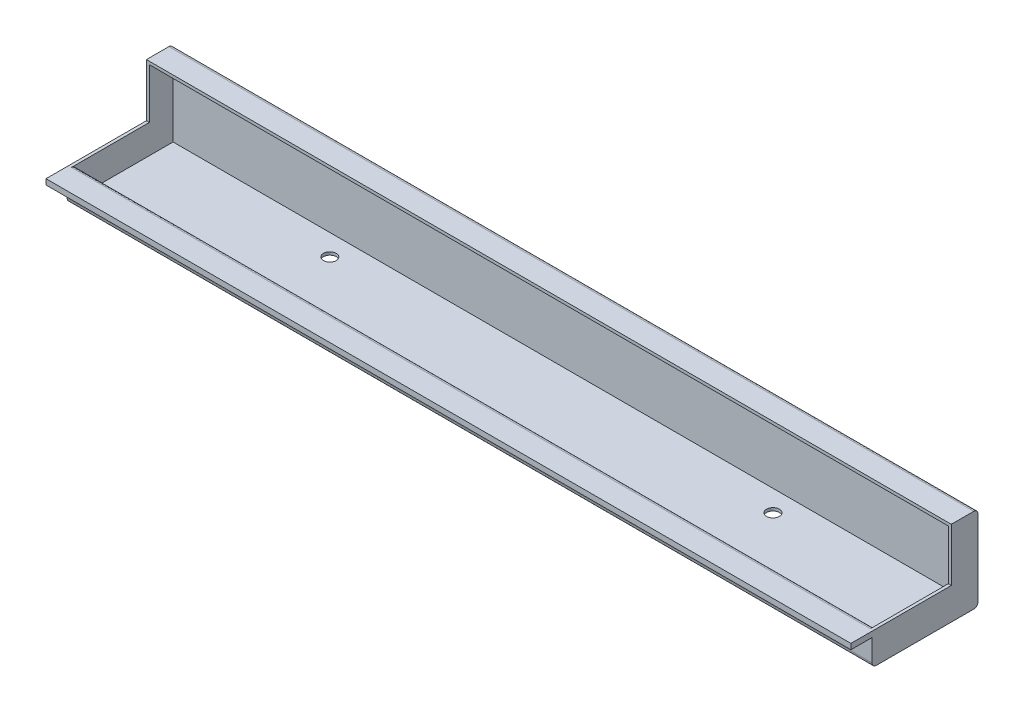
ISO-10303-21;
HEADER;
FILE_DESCRIPTION(('STEP AP214'),'2;1');
FILE_NAME('part.step','',(''),(''),'','','');
FILE_SCHEMA(('AUTOMOTIVE_DESIGN { 1 0 10303 214 1 1 1 1 }'));
ENDSEC;
DATA;
#1=APPLICATION_CONTEXT('core data for automotive mechanical design processes');
#2=APPLICATION_PROTOCOL_DEFINITION('international standard','automotive_design',2000,#1);
#3=PRODUCT_CONTEXT('',#1,'mechanical');
#4=PRODUCT('Part','Part','',(#3));
#5=PRODUCT_RELATED_PRODUCT_CATEGORY('part','',(#4));
#6=PRODUCT_DEFINITION_FORMATION('','',#4);
#7=PRODUCT_DEFINITION_CONTEXT('part definition',#1,'design');
#8=PRODUCT_DEFINITION('design','',#6,#7);
#9=PRODUCT_DEFINITION_SHAPE('','',#8);
#10=(LENGTH_UNIT() NAMED_UNIT(*) SI_UNIT(.MILLI.,.METRE.));
#11=(NAMED_UNIT(*) PLANE_ANGLE_UNIT() SI_UNIT($,.RADIAN.));
#12=(NAMED_UNIT(*) SI_UNIT($,.STERADIAN.) SOLID_ANGLE_UNIT());
#13=UNCERTAINTY_MEASURE_WITH_UNIT(LENGTH_MEASURE(1.E-05),#10,'distance_accuracy_value','');
#14=(GEOMETRIC_REPRESENTATION_CONTEXT(3) GLOBAL_UNCERTAINTY_ASSIGNED_CONTEXT((#13)) GLOBAL_UNIT_ASSIGNED_CONTEXT((#10,
#11,#12)) REPRESENTATION_CONTEXT('',''));
#15=CARTESIAN_POINT('',(0.,0.,0.));
#16=DIRECTION('',(0.,0.,1.));
#17=DIRECTION('',(1.,0.,0.));
#18=AXIS2_PLACEMENT_3D('',#15,#16,#17);
#19=CARTESIAN_POINT('',(0.,-23.622,0.));
#20=DIRECTION('',(0.,1.,0.));
#21=DIRECTION('',(0.,0.,1.));
#22=AXIS2_PLACEMENT_3D('',#19,#20,#21);
#23=PLANE('',#22);
#24=CARTESIAN_POINT('',(132.842,-23.622,14.4780000000006));
#25=DIRECTION('',(0.,-1.,0.));
#26=DIRECTION('',(0.,0.,-1.));
#27=AXIS2_PLACEMENT_3D('',#24,#25,#26);
#28=CIRCLE('',#27,3.81000000000002);
#29=CARTESIAN_POINT('',(132.842,-23.622,10.6680000000006));
#30=VERTEX_POINT('',#29);
#31=EDGE_CURVE('E297',#30,#30,#28,.T.);
#32=ORIENTED_EDGE('',*,*,#31,.T.);
#33=EDGE_LOOP('',(#32));
#34=FACE_BOUND('',#33,.T.);
#35=DIRECTION('',(1.,0.,0.));
#36=VECTOR('',#35,1.);
#37=CARTESIAN_POINT('',(0.,-23.622,60.198));
#38=LINE('',#37,#36);
#39=CARTESIAN_POINT('',(-239.522,-23.622,60.198));
#40=VERTEX_POINT('',#39);
#41=CARTESIAN_POINT('',(239.522,-23.6220000000009,60.198));
#42=VERTEX_POINT('',#41);
#43=EDGE_CURVE('E189',#40,#42,#38,.T.);
#44=ORIENTED_EDGE('',*,*,#43,.T.);
#45=DIRECTION('',(0.,0.,-1.));
#46=VECTOR('',#45,1.);
#47=CARTESIAN_POINT('',(239.522,-23.622,76.2));
#48=LINE('',#47,#46);
#49=CARTESIAN_POINT('',(239.522,-23.622,1.778));
#50=VERTEX_POINT('',#49);
#51=EDGE_CURVE('E170',#42,#50,#48,.T.);
#52=ORIENTED_EDGE('',*,*,#51,.T.);
#53=DIRECTION('',(1.,0.,0.));
#54=VECTOR('',#53,1.);
#55=CARTESIAN_POINT('',(0.,-23.622,1.778));
#56=LINE('',#55,#54);
#57=CARTESIAN_POINT('',(-239.522,-23.622,1.778));
#58=VERTEX_POINT('',#57);
#59=EDGE_CURVE('E183',#58,#50,#56,.T.);
#60=ORIENTED_EDGE('',*,*,#59,.F.);
#61=DIRECTION('',(0.,0.,-1.));
#62=VECTOR('',#61,1.);
#63=CARTESIAN_POINT('',(-239.522,-23.622,76.2));
#64=LINE('',#63,#62);
#65=EDGE_CURVE('E182',#40,#58,#64,.T.);
#66=ORIENTED_EDGE('',*,*,#65,.F.);
#67=EDGE_LOOP('',(#44,#52,#60,#66));
#68=FACE_BOUND('',#67,.T.);
#69=CARTESIAN_POINT('',(-132.842,-23.622,14.478));
#70=DIRECTION('',(0.,1.,0.));
#71=DIRECTION('',(0.,0.,1.));
#72=AXIS2_PLACEMENT_3D('',#69,#70,#71);
#73=CIRCLE('',#72,3.81000000000001);
#74=CARTESIAN_POINT('',(-132.842,-23.622,18.288));
#75=VERTEX_POINT('',#74);
#76=EDGE_CURVE('E290',#75,#75,#73,.T.);
#77=ORIENTED_EDGE('',*,*,#76,.F.);
#78=EDGE_LOOP('',(#77));
#79=FACE_BOUND('',#78,.T.);
#80=ADVANCED_FACE('F41',(#34,#68,#79),#23,.T.);
#81=CARTESIAN_POINT('',(-241.3,-25.4,76.2));
#82=DIRECTION('',(0.,1.,0.));
#83=DIRECTION('',(0.,0.,1.));
#84=AXIS2_PLACEMENT_3D('',#81,#82,#83);
#85=PLANE('',#84);
#86=DIRECTION('',(0.,0.,-1.));
#87=VECTOR('',#86,1.);
#88=CARTESIAN_POINT('',(241.3,-25.4,76.2));
#89=LINE('',#88,#87);
#90=CARTESIAN_POINT('',(241.3,-25.4,60.96));
#91=VERTEX_POINT('',#90);
#92=CARTESIAN_POINT('',(241.3,-25.4,2.54000000000003));
#93=VERTEX_POINT('',#92);
#94=EDGE_CURVE('E223',#91,#93,#89,.T.);
#95=ORIENTED_EDGE('',*,*,#94,.F.);
#96=DIRECTION('',(1.,0.,0.));
#97=VECTOR('',#96,1.);
#98=CARTESIAN_POINT('',(-241.3,-25.4,60.96));
#99=LINE('',#98,#97);
#100=CARTESIAN_POINT('',(-241.3,-25.4,60.96));
#101=VERTEX_POINT('',#100);
#102=EDGE_CURVE('E266',#91,#101,#99,.F.);
#103=ORIENTED_EDGE('',*,*,#102,.T.);
#104=DIRECTION('',(0.,0.,-1.));
#105=VECTOR('',#104,1.);
#106=CARTESIAN_POINT('',(-241.3,-25.4,76.2));
#107=LINE('',#106,#105);
#108=CARTESIAN_POINT('',(-241.3,-25.4,2.54000000000003));
#109=VERTEX_POINT('',#108);
#110=EDGE_CURVE('E232',#101,#109,#107,.T.);
#111=ORIENTED_EDGE('',*,*,#110,.T.);
#112=DIRECTION('',(1.,0.,0.));
#113=VECTOR('',#112,1.);
#114=CARTESIAN_POINT('',(241.3,-25.4,2.54));
#115=LINE('',#114,#113);
#116=EDGE_CURVE('E262',#109,#93,#115,.T.);
#117=ORIENTED_EDGE('',*,*,#116,.T.);
#118=EDGE_LOOP('',(#95,#103,#111,#117));
#119=FACE_BOUND('',#118,.T.);
#120=CARTESIAN_POINT('',(132.842,-25.4,14.4780000000006));
#121=DIRECTION('',(0.,1.,0.));
#122=DIRECTION('',(0.,0.,1.));
#123=AXIS2_PLACEMENT_3D('',#120,#121,#122);
#124=CIRCLE('',#123,3.81000000000002);
#125=CARTESIAN_POINT('',(132.842,-25.4,18.2880000000006));
#126=VERTEX_POINT('',#125);
#127=EDGE_CURVE('E287',#126,#126,#124,.F.);
#128=ORIENTED_EDGE('',*,*,#127,.F.);
#129=EDGE_LOOP('',(#128));
#130=FACE_BOUND('',#129,.T.);
#131=CARTESIAN_POINT('',(-132.842,-25.4,14.478));
#132=DIRECTION('',(0.,1.,0.));
#133=DIRECTION('',(0.,0.,1.));
#134=AXIS2_PLACEMENT_3D('',#131,#132,#133);
#135=CIRCLE('',#134,3.81000000000001);
#136=CARTESIAN_POINT('',(-132.842,-25.4,18.288));
#137=VERTEX_POINT('',#136);
#138=EDGE_CURVE('E45',#137,#137,#135,.T.);
#139=ORIENTED_EDGE('',*,*,#138,.T.);
#140=EDGE_LOOP('',(#139));
#141=FACE_BOUND('',#140,.T.);
#142=ADVANCED_FACE('F406',(#119,#130,#141),#85,.F.);
#143=CARTESIAN_POINT('',(0.,-23.622,60.198));
#144=DIRECTION('',(0.,0.,1.));
#145=DIRECTION('',(1.,0.,0.));
#146=AXIS2_PLACEMENT_3D('',#143,#144,#145);
#147=PLANE('',#146);
#148=DIRECTION('',(0.,1.,0.));
#149=VECTOR('',#148,1.);
#150=CARTESIAN_POINT('',(-239.522,0.,60.198));
#151=LINE('',#150,#149);
#152=CARTESIAN_POINT('',(-239.522,-8.89,60.198));
#153=VERTEX_POINT('',#152);
#154=EDGE_CURVE('E309',#40,#153,#151,.T.);
#155=ORIENTED_EDGE('',*,*,#154,.T.);
#156=DIRECTION('',(-1.,0.,0.));
#157=VECTOR('',#156,1.);
#158=CARTESIAN_POINT('',(239.522,-8.89,60.198));
#159=LINE('',#158,#157);
#160=CARTESIAN_POINT('',(239.522,-8.89,60.198));
#161=VERTEX_POINT('',#160);
#162=EDGE_CURVE('E191',#153,#161,#159,.F.);
#163=ORIENTED_EDGE('',*,*,#162,.T.);
#164=DIRECTION('',(0.,1.,0.));
#165=VECTOR('',#164,1.);
#166=CARTESIAN_POINT('',(239.522,-23.6220000000009,60.198));
#167=LINE('',#166,#165);
#168=EDGE_CURVE('E173',#42,#161,#167,.T.);
#169=ORIENTED_EDGE('',*,*,#168,.F.);
#170=ORIENTED_EDGE('',*,*,#43,.F.);
#171=EDGE_LOOP('',(#155,#163,#169,#170));
#172=FACE_BOUND('',#171,.T.);
#173=ADVANCED_FACE('F188',(#172),#147,.F.);
#174=CARTESIAN_POINT('',(0.,-23.622,16.002));
#175=DIRECTION('',(0.,0.,1.));
#176=DIRECTION('',(1.,0.,0.));
#177=AXIS2_PLACEMENT_3D('',#174,#175,#176);
#178=PLANE('',#177);
#179=DIRECTION('',(-1.,0.,0.));
#180=VECTOR('',#179,1.);
#181=CARTESIAN_POINT('',(0.,-6.34999999999999,16.002));
#182=LINE('',#181,#180);
#183=CARTESIAN_POINT('',(241.3,-6.35000000000093,16.002));
#184=VERTEX_POINT('',#183);
#185=CARTESIAN_POINT('',(239.522,-6.35000000000092,16.002));
#186=VERTEX_POINT('',#185);
#187=EDGE_CURVE('E193',#184,#186,#182,.T.);
#188=ORIENTED_EDGE('',*,*,#187,.F.);
#189=DIRECTION('',(0.,1.,0.));
#190=VECTOR('',#189,1.);
#191=CARTESIAN_POINT('',(241.3,-23.622,16.002));
#192=LINE('',#191,#190);
#193=CARTESIAN_POINT('',(241.3,25.4,16.002));
#194=VERTEX_POINT('',#193);
#195=EDGE_CURVE('E199',#184,#194,#192,.T.);
#196=ORIENTED_EDGE('',*,*,#195,.T.);
#197=DIRECTION('',(1.,0.,0.));
#198=VECTOR('',#197,1.);
#199=CARTESIAN_POINT('',(0.,25.4,16.002));
#200=LINE('',#199,#198);
#201=CARTESIAN_POINT('',(-241.3,25.4,16.002));
#202=VERTEX_POINT('',#201);
#203=EDGE_CURVE('E200',#202,#194,#200,.T.);
#204=ORIENTED_EDGE('',*,*,#203,.F.);
#205=DIRECTION('',(0.,1.,0.));
#206=VECTOR('',#205,1.);
#207=CARTESIAN_POINT('',(-241.3,-23.622,16.002));
#208=LINE('',#207,#206);
#209=CARTESIAN_POINT('',(-241.3,-6.34999999999999,16.002));
#210=VERTEX_POINT('',#209);
#211=EDGE_CURVE('E204',#210,#202,#208,.T.);
#212=ORIENTED_EDGE('',*,*,#211,.F.);
#213=DIRECTION('',(1.,0.,0.));
#214=VECTOR('',#213,1.);
#215=CARTESIAN_POINT('',(0.,-6.34999999999999,16.002));
#216=LINE('',#215,#214);
#217=CARTESIAN_POINT('',(-239.522,-6.34999999999999,16.002));
#218=VERTEX_POINT('',#217);
#219=EDGE_CURVE('E315',#210,#218,#216,.T.);
#220=ORIENTED_EDGE('',*,*,#219,.T.);
#221=DIRECTION('',(0.,1.,0.));
#222=VECTOR('',#221,1.);
#223=CARTESIAN_POINT('',(-239.522,-23.622,16.002));
#224=LINE('',#223,#222);
#225=CARTESIAN_POINT('',(-239.522,23.622,16.002));
#226=VERTEX_POINT('',#225);
#227=EDGE_CURVE('E323',#218,#226,#224,.T.);
#228=ORIENTED_EDGE('',*,*,#227,.T.);
#229=DIRECTION('',(1.,0.,0.));
#230=VECTOR('',#229,1.);
#231=CARTESIAN_POINT('',(0.,23.622,16.002));
#232=LINE('',#231,#230);
#233=CARTESIAN_POINT('',(239.522,23.622,16.002));
#234=VERTEX_POINT('',#233);
#235=EDGE_CURVE('E318',#226,#234,#232,.T.);
#236=ORIENTED_EDGE('',*,*,#235,.T.);
#237=DIRECTION('',(0.,1.,0.));
#238=VECTOR('',#237,1.);
#239=CARTESIAN_POINT('',(239.522,-25.4,16.002));
#240=LINE('',#239,#238);
#241=EDGE_CURVE('E342',#186,#234,#240,.T.);
#242=ORIENTED_EDGE('',*,*,#241,.F.);
#243=EDGE_LOOP('',(#188,#196,#204,#212,#220,#228,#236,#242));
#244=FACE_BOUND('',#243,.T.);
#245=ADVANCED_FACE('F387',(#244),#178,.T.);
#246=CARTESIAN_POINT('',(241.3,-25.4,76.2));
#247=DIRECTION('',(-1.,0.,0.));
#248=DIRECTION('',(0.,0.,1.));
#249=AXIS2_PLACEMENT_3D('',#246,#247,#248);
#250=PLANE('',#249);
#251=DIRECTION('',(0.,1.,0.));
#252=VECTOR('',#251,1.);
#253=CARTESIAN_POINT('',(241.3,-25.4,63.5));
#254=LINE('',#253,#252);
#255=CARTESIAN_POINT('',(241.3,-22.86,63.5));
#256=VERTEX_POINT('',#255);
#257=CARTESIAN_POINT('',(241.3,-9.65199999999999,63.5));
#258=VERTEX_POINT('',#257);
#259=EDGE_CURVE('E354',#256,#258,#254,.T.);
#260=ORIENTED_EDGE('',*,*,#259,.F.);
#261=CARTESIAN_POINT('',(241.3,-22.86,60.96));
#262=DIRECTION('',(-1.,0.,0.));
#263=DIRECTION('',(0.,0.,1.));
#264=AXIS2_PLACEMENT_3D('',#261,#262,#263);
#265=CIRCLE('',#264,2.54);
#266=EDGE_CURVE('E259',#256,#91,#265,.F.);
#267=ORIENTED_EDGE('',*,*,#266,.T.);
#268=ORIENTED_EDGE('',*,*,#94,.T.);
#269=CARTESIAN_POINT('',(241.3,-22.86,2.54));
#270=DIRECTION('',(-1.,0.,0.));
#271=DIRECTION('',(0.,0.,1.));
#272=AXIS2_PLACEMENT_3D('',#269,#270,#271);
#273=CIRCLE('',#272,2.54);
#274=CARTESIAN_POINT('',(241.3,-22.86,0.));
#275=VERTEX_POINT('',#274);
#276=EDGE_CURVE('E256',#93,#275,#273,.F.);
#277=ORIENTED_EDGE('',*,*,#276,.T.);
#278=DIRECTION('',(0.,1.,0.));
#279=VECTOR('',#278,1.);
#280=CARTESIAN_POINT('',(241.3,-25.4,0.));
#281=LINE('',#280,#279);
#282=CARTESIAN_POINT('',(241.3,22.86,0.));
#283=VERTEX_POINT('',#282);
#284=EDGE_CURVE('E213',#275,#283,#281,.T.);
#285=ORIENTED_EDGE('',*,*,#284,.T.);
#286=CARTESIAN_POINT('',(241.3,22.86,2.54));
#287=DIRECTION('',(-1.,0.,0.));
#288=DIRECTION('',(0.,0.,1.));
#289=AXIS2_PLACEMENT_3D('',#286,#287,#288);
#290=CIRCLE('',#289,2.54);
#291=CARTESIAN_POINT('',(241.3,25.4,2.54000000000003));
#292=VERTEX_POINT('',#291);
#293=EDGE_CURVE('E253',#283,#292,#290,.F.);
#294=ORIENTED_EDGE('',*,*,#293,.T.);
#295=DIRECTION('',(0.,0.,-1.));
#296=VECTOR('',#295,1.);
#297=CARTESIAN_POINT('',(241.3,25.4,76.2));
#298=LINE('',#297,#296);
#299=EDGE_CURVE('E239',#194,#292,#298,.T.);
#300=ORIENTED_EDGE('',*,*,#299,.F.);
#301=ORIENTED_EDGE('',*,*,#195,.F.);
#302=DIRECTION('',(0.,0.,-1.));
#303=VECTOR('',#302,1.);
#304=CARTESIAN_POINT('',(241.3,-6.34999999999999,60.198));
#305=LINE('',#304,#303);
#306=CARTESIAN_POINT('',(241.3,-6.34999999999999,76.2));
#307=VERTEX_POINT('',#306);
#308=EDGE_CURVE('E207',#307,#184,#305,.T.);
#309=ORIENTED_EDGE('',*,*,#308,.F.);
#310=DIRECTION('',(0.,1.,0.));
#311=VECTOR('',#310,1.);
#312=CARTESIAN_POINT('',(241.3,-25.4,76.2));
#313=LINE('',#312,#311);
#314=CARTESIAN_POINT('',(241.3,-9.65199999999999,76.2));
#315=VERTEX_POINT('',#314);
#316=EDGE_CURVE('E215',#315,#307,#313,.T.);
#317=ORIENTED_EDGE('',*,*,#316,.F.);
#318=DIRECTION('',(0.,0.,1.));
#319=VECTOR('',#318,1.);
#320=CARTESIAN_POINT('',(241.3,-9.65199999999999,63.5));
#321=LINE('',#320,#319);
#322=EDGE_CURVE('E361',#258,#315,#321,.T.);
#323=ORIENTED_EDGE('',*,*,#322,.F.);
#324=EDGE_LOOP('',(#260,#267,#268,#277,#285,#294,#300,#301,#309,#317,#323));
#325=FACE_BOUND('',#324,.T.);
#326=ADVANCED_FACE('F391',(#325),#250,.F.);
#327=CARTESIAN_POINT('',(-241.3,-25.4,76.2));
#328=DIRECTION('',(1.,0.,0.));
#329=DIRECTION('',(0.,0.,-1.));
#330=AXIS2_PLACEMENT_3D('',#327,#328,#329);
#331=PLANE('',#330);
#332=ORIENTED_EDGE('',*,*,#110,.F.);
#333=CARTESIAN_POINT('',(-241.3,-22.86,60.96));
#334=DIRECTION('',(1.,0.,0.));
#335=DIRECTION('',(0.,0.,-1.));
#336=AXIS2_PLACEMENT_3D('',#333,#334,#335);
#337=CIRCLE('',#336,2.54);
#338=CARTESIAN_POINT('',(-241.3,-22.86,63.5));
#339=VERTEX_POINT('',#338);
#340=EDGE_CURVE('E274',#101,#339,#337,.F.);
#341=ORIENTED_EDGE('',*,*,#340,.T.);
#342=DIRECTION('',(0.,-1.,0.));
#343=VECTOR('',#342,1.);
#344=CARTESIAN_POINT('',(-241.3,-25.4,63.5));
#345=LINE('',#344,#343);
#346=CARTESIAN_POINT('',(-241.3,-9.65199999999999,63.5));
#347=VERTEX_POINT('',#346);
#348=EDGE_CURVE('E350',#347,#339,#345,.T.);
#349=ORIENTED_EDGE('',*,*,#348,.F.);
#350=DIRECTION('',(0.,0.,1.));
#351=VECTOR('',#350,1.);
#352=CARTESIAN_POINT('',(-241.3,-9.65199999999999,63.5));
#353=LINE('',#352,#351);
#354=CARTESIAN_POINT('',(-241.3,-9.65199999999999,76.2));
#355=VERTEX_POINT('',#354);
#356=EDGE_CURVE('E364',#347,#355,#353,.T.);
#357=ORIENTED_EDGE('',*,*,#356,.T.);
#358=DIRECTION('',(0.,-1.,0.));
#359=VECTOR('',#358,1.);
#360=CARTESIAN_POINT('',(-241.3,-25.4,76.2));
#361=LINE('',#360,#359);
#362=CARTESIAN_POINT('',(-241.3,-6.34999999999999,76.2));
#363=VERTEX_POINT('',#362);
#364=EDGE_CURVE('E218',#363,#355,#361,.T.);
#365=ORIENTED_EDGE('',*,*,#364,.F.);
#366=DIRECTION('',(0.,0.,1.));
#367=VECTOR('',#366,1.);
#368=CARTESIAN_POINT('',(-241.3,-6.34999999999999,60.198));
#369=LINE('',#368,#367);
#370=EDGE_CURVE('E368',#210,#363,#369,.T.);
#371=ORIENTED_EDGE('',*,*,#370,.F.);
#372=ORIENTED_EDGE('',*,*,#211,.T.);
#373=DIRECTION('',(0.,0.,-1.));
#374=VECTOR('',#373,1.);
#375=CARTESIAN_POINT('',(-241.3,25.4,76.2));
#376=LINE('',#375,#374);
#377=CARTESIAN_POINT('',(-241.3,25.4,2.54000000000003));
#378=VERTEX_POINT('',#377);
#379=EDGE_CURVE('E236',#202,#378,#376,.T.);
#380=ORIENTED_EDGE('',*,*,#379,.T.);
#381=CARTESIAN_POINT('',(-241.3,22.86,2.54));
#382=DIRECTION('',(1.,0.,0.));
#383=DIRECTION('',(0.,0.,-1.));
#384=AXIS2_PLACEMENT_3D('',#381,#382,#383);
#385=CIRCLE('',#384,2.54);
#386=CARTESIAN_POINT('',(-241.3,22.86,0.));
#387=VERTEX_POINT('',#386);
#388=EDGE_CURVE('E66',#378,#387,#385,.F.);
#389=ORIENTED_EDGE('',*,*,#388,.T.);
#390=DIRECTION('',(0.,-1.,0.));
#391=VECTOR('',#390,1.);
#392=CARTESIAN_POINT('',(-241.3,-25.4,0.));
#393=LINE('',#392,#391);
#394=CARTESIAN_POINT('',(-241.3,-22.86,0.));
#395=VERTEX_POINT('',#394);
#396=EDGE_CURVE('E219',#387,#395,#393,.T.);
#397=ORIENTED_EDGE('',*,*,#396,.T.);
#398=CARTESIAN_POINT('',(-241.3,-22.86,2.54));
#399=DIRECTION('',(1.,0.,0.));
#400=DIRECTION('',(0.,0.,-1.));
#401=AXIS2_PLACEMENT_3D('',#398,#399,#400);
#402=CIRCLE('',#401,2.54);
#403=EDGE_CURVE('E271',#395,#109,#402,.F.);
#404=ORIENTED_EDGE('',*,*,#403,.T.);
#405=EDGE_LOOP('',(#332,#341,#349,#357,#365,#371,#372,#380,#389,#397,#404));
#406=FACE_BOUND('',#405,.T.);
#407=ADVANCED_FACE('F411',(#406),#331,.F.);
#408=CARTESIAN_POINT('',(0.,0.,76.2));
#409=DIRECTION('',(0.,0.,-1.));
#410=DIRECTION('',(-1.,0.,0.));
#411=AXIS2_PLACEMENT_3D('',#408,#409,#410);
#412=PLANE('',#411);
#413=ORIENTED_EDGE('',*,*,#364,.T.);
#414=DIRECTION('',(-1.,0.,0.));
#415=VECTOR('',#414,1.);
#416=CARTESIAN_POINT('',(-241.3,-9.65199999999999,76.2));
#417=LINE('',#416,#415);
#418=EDGE_CURVE('E327',#315,#355,#417,.T.);
#419=ORIENTED_EDGE('',*,*,#418,.F.);
#420=ORIENTED_EDGE('',*,*,#316,.T.);
#421=DIRECTION('',(1.,0.,0.));
#422=VECTOR('',#421,1.);
#423=CARTESIAN_POINT('',(-241.3,-6.34999999999999,76.2));
#424=LINE('',#423,#422);
#425=EDGE_CURVE('E372',#363,#307,#424,.T.);
#426=ORIENTED_EDGE('',*,*,#425,.F.);
#427=EDGE_LOOP('',(#413,#419,#420,#426));
#428=FACE_BOUND('',#427,.T.);
#429=ADVANCED_FACE('F424',(#428),#412,.F.);
#430=CARTESIAN_POINT('',(-241.3,25.4,76.2));
#431=DIRECTION('',(0.,-1.,0.));
#432=DIRECTION('',(0.,0.,-1.));
#433=AXIS2_PLACEMENT_3D('',#430,#431,#432);
#434=PLANE('',#433);
#435=ORIENTED_EDGE('',*,*,#299,.T.);
#436=DIRECTION('',(-1.,0.,0.));
#437=VECTOR('',#436,1.);
#438=CARTESIAN_POINT('',(-241.3,25.4,2.54));
#439=LINE('',#438,#437);
#440=EDGE_CURVE('E282',#292,#378,#439,.T.);
#441=ORIENTED_EDGE('',*,*,#440,.T.);
#442=ORIENTED_EDGE('',*,*,#379,.F.);
#443=ORIENTED_EDGE('',*,*,#203,.T.);
#444=EDGE_LOOP('',(#435,#441,#442,#443));
#445=FACE_BOUND('',#444,.T.);
#446=ADVANCED_FACE('F395',(#445),#434,.F.);
#447=CARTESIAN_POINT('',(0.,0.,0.));
#448=DIRECTION('',(0.,0.,-1.));
#449=DIRECTION('',(-1.,0.,0.));
#450=AXIS2_PLACEMENT_3D('',#447,#448,#449);
#451=PLANE('',#450);
#452=ORIENTED_EDGE('',*,*,#284,.F.);
#453=DIRECTION('',(1.,0.,0.));
#454=VECTOR('',#453,1.);
#455=CARTESIAN_POINT('',(-241.3,-22.86,0.));
#456=LINE('',#455,#454);
#457=EDGE_CURVE('E59',#275,#395,#456,.F.);
#458=ORIENTED_EDGE('',*,*,#457,.T.);
#459=ORIENTED_EDGE('',*,*,#396,.F.);
#460=DIRECTION('',(-1.,0.,0.));
#461=VECTOR('',#460,1.);
#462=CARTESIAN_POINT('',(241.3,22.86,0.));
#463=LINE('',#462,#461);
#464=EDGE_CURVE('E277',#387,#283,#463,.F.);
#465=ORIENTED_EDGE('',*,*,#464,.T.);
#466=EDGE_LOOP('',(#452,#458,#459,#465));
#467=FACE_BOUND('',#466,.T.);
#468=ADVANCED_FACE('F399',(#467),#451,.T.);
#469=CARTESIAN_POINT('',(0.,-6.34999999999999,0.));
#470=DIRECTION('',(0.,1.,0.));
#471=DIRECTION('',(0.,0.,1.));
#472=AXIS2_PLACEMENT_3D('',#469,#470,#471);
#473=PLANE('',#472);
#474=DIRECTION('',(-1.,0.,0.));
#475=VECTOR('',#474,1.);
#476=CARTESIAN_POINT('',(-239.522,-6.34999999999999,62.738));
#477=LINE('',#476,#475);
#478=CARTESIAN_POINT('',(239.522,-6.35000000000092,62.738));
#479=VERTEX_POINT('',#478);
#480=CARTESIAN_POINT('',(-239.522,-6.34999999999999,62.738));
#481=VERTEX_POINT('',#480);
#482=EDGE_CURVE('E243',#479,#481,#477,.T.);
#483=ORIENTED_EDGE('',*,*,#482,.T.);
#484=DIRECTION('',(0.,0.,1.));
#485=VECTOR('',#484,1.);
#486=CARTESIAN_POINT('',(-239.522,-6.34999999999999,15.748));
#487=LINE('',#486,#485);
#488=EDGE_CURVE('E312',#218,#481,#487,.T.);
#489=ORIENTED_EDGE('',*,*,#488,.F.);
#490=ORIENTED_EDGE('',*,*,#219,.F.);
#491=ORIENTED_EDGE('',*,*,#370,.T.);
#492=ORIENTED_EDGE('',*,*,#425,.T.);
#493=ORIENTED_EDGE('',*,*,#308,.T.);
#494=ORIENTED_EDGE('',*,*,#187,.T.);
#495=DIRECTION('',(0.,0.,1.));
#496=VECTOR('',#495,1.);
#497=CARTESIAN_POINT('',(239.522,-6.35000000000092,15.748));
#498=LINE('',#497,#496);
#499=EDGE_CURVE('E194',#186,#479,#498,.T.);
#500=ORIENTED_EDGE('',*,*,#499,.T.);
#501=EDGE_LOOP('',(#483,#489,#490,#491,#492,#493,#494,#500));
#502=FACE_BOUND('',#501,.T.);
#503=ADVANCED_FACE('F380',(#502),#473,.T.);
#504=CARTESIAN_POINT('',(-241.3,-9.65199999999999,63.5));
#505=DIRECTION('',(0.,1.,0.));
#506=DIRECTION('',(0.,0.,1.));
#507=AXIS2_PLACEMENT_3D('',#504,#505,#506);
#508=PLANE('',#507);
#509=ORIENTED_EDGE('',*,*,#418,.T.);
#510=ORIENTED_EDGE('',*,*,#356,.F.);
#511=DIRECTION('',(-1.,0.,0.));
#512=VECTOR('',#511,1.);
#513=CARTESIAN_POINT('',(-241.3,-9.65199999999999,63.5));
#514=LINE('',#513,#512);
#515=EDGE_CURVE('E357',#258,#347,#514,.T.);
#516=ORIENTED_EDGE('',*,*,#515,.F.);
#517=ORIENTED_EDGE('',*,*,#322,.T.);
#518=EDGE_LOOP('',(#509,#510,#516,#517));
#519=FACE_BOUND('',#518,.T.);
#520=ADVANCED_FACE('F422',(#519),#508,.F.);
#521=CARTESIAN_POINT('',(0.,0.,63.5));
#522=DIRECTION('',(0.,0.,-1.));
#523=DIRECTION('',(-1.,0.,0.));
#524=AXIS2_PLACEMENT_3D('',#521,#522,#523);
#525=PLANE('',#524);
#526=ORIENTED_EDGE('',*,*,#348,.T.);
#527=DIRECTION('',(1.,0.,0.));
#528=VECTOR('',#527,1.);
#529=CARTESIAN_POINT('',(0.,-22.86,63.5));
#530=LINE('',#529,#528);
#531=EDGE_CURVE('E249',#339,#256,#530,.T.);
#532=ORIENTED_EDGE('',*,*,#531,.T.);
#533=ORIENTED_EDGE('',*,*,#259,.T.);
#534=ORIENTED_EDGE('',*,*,#515,.T.);
#535=EDGE_LOOP('',(#526,#532,#533,#534));
#536=FACE_BOUND('',#535,.T.);
#537=ADVANCED_FACE('F417',(#536),#525,.F.);
#538=CARTESIAN_POINT('',(239.522,-25.4,76.2));
#539=DIRECTION('',(-1.,0.,0.));
#540=DIRECTION('',(0.,0.,1.));
#541=AXIS2_PLACEMENT_3D('',#538,#539,#540);
#542=PLANE('',#541);
#543=ORIENTED_EDGE('',*,*,#51,.F.);
#544=ORIENTED_EDGE('',*,*,#168,.T.);
#545=CARTESIAN_POINT('',(239.522,-8.89,62.738));
#546=DIRECTION('',(-1.,0.,0.));
#547=DIRECTION('',(0.,0.,1.));
#548=AXIS2_PLACEMENT_3D('',#545,#546,#547);
#549=CIRCLE('',#548,2.54);
#550=EDGE_CURVE('E11',#161,#479,#549,.F.);
#551=ORIENTED_EDGE('',*,*,#550,.T.);
#552=ORIENTED_EDGE('',*,*,#499,.F.);
#553=ORIENTED_EDGE('',*,*,#241,.T.);
#554=DIRECTION('',(0.,0.,-1.));
#555=VECTOR('',#554,1.);
#556=CARTESIAN_POINT('',(239.522,23.622,76.2));
#557=LINE('',#556,#555);
#558=CARTESIAN_POINT('',(239.522,23.622,1.778));
#559=VERTEX_POINT('',#558);
#560=EDGE_CURVE('E324',#234,#559,#557,.T.);
#561=ORIENTED_EDGE('',*,*,#560,.T.);
#562=DIRECTION('',(0.,1.,0.));
#563=VECTOR('',#562,1.);
#564=CARTESIAN_POINT('',(239.522,0.,1.778));
#565=LINE('',#564,#563);
#566=EDGE_CURVE('E176',#50,#559,#565,.T.);
#567=ORIENTED_EDGE('',*,*,#566,.F.);
#568=EDGE_LOOP('',(#543,#544,#551,#552,#553,#561,#567));
#569=FACE_BOUND('',#568,.T.);
#570=ADVANCED_FACE('F172',(#569),#542,.T.);
#571=CARTESIAN_POINT('',(-239.522,-25.4,76.2));
#572=DIRECTION('',(1.,0.,0.));
#573=DIRECTION('',(0.,0.,-1.));
#574=AXIS2_PLACEMENT_3D('',#571,#572,#573);
#575=PLANE('',#574);
#576=ORIENTED_EDGE('',*,*,#227,.F.);
#577=ORIENTED_EDGE('',*,*,#488,.T.);
#578=CARTESIAN_POINT('',(-239.522,-8.89,62.738));
#579=DIRECTION('',(1.,0.,0.));
#580=DIRECTION('',(0.,0.,-1.));
#581=AXIS2_PLACEMENT_3D('',#578,#579,#580);
#582=CIRCLE('',#581,2.54);
#583=EDGE_CURVE('E51',#481,#153,#582,.F.);
#584=ORIENTED_EDGE('',*,*,#583,.T.);
#585=ORIENTED_EDGE('',*,*,#154,.F.);
#586=ORIENTED_EDGE('',*,*,#65,.T.);
#587=DIRECTION('',(0.,-1.,0.));
#588=VECTOR('',#587,1.);
#589=CARTESIAN_POINT('',(-239.522,0.,1.778));
#590=LINE('',#589,#588);
#591=CARTESIAN_POINT('',(-239.522,23.622,1.778));
#592=VERTEX_POINT('',#591);
#593=EDGE_CURVE('E331',#592,#58,#590,.T.);
#594=ORIENTED_EDGE('',*,*,#593,.F.);
#595=DIRECTION('',(0.,0.,-1.));
#596=VECTOR('',#595,1.);
#597=CARTESIAN_POINT('',(-239.522,23.622,76.2));
#598=LINE('',#597,#596);
#599=EDGE_CURVE('E328',#226,#592,#598,.T.);
#600=ORIENTED_EDGE('',*,*,#599,.F.);
#601=EDGE_LOOP('',(#576,#577,#584,#585,#586,#594,#600));
#602=FACE_BOUND('',#601,.T.);
#603=ADVANCED_FACE('F431',(#602),#575,.T.);
#604=CARTESIAN_POINT('',(-241.3,23.622,76.2));
#605=DIRECTION('',(0.,-1.,0.));
#606=DIRECTION('',(0.,0.,-1.));
#607=AXIS2_PLACEMENT_3D('',#604,#605,#606);
#608=PLANE('',#607);
#609=ORIENTED_EDGE('',*,*,#235,.F.);
#610=ORIENTED_EDGE('',*,*,#599,.T.);
#611=DIRECTION('',(-1.,0.,0.));
#612=VECTOR('',#611,1.);
#613=CARTESIAN_POINT('',(0.,23.622,1.778));
#614=LINE('',#613,#612);
#615=EDGE_CURVE('E322',#559,#592,#614,.T.);
#616=ORIENTED_EDGE('',*,*,#615,.F.);
#617=ORIENTED_EDGE('',*,*,#560,.F.);
#618=EDGE_LOOP('',(#609,#610,#616,#617));
#619=FACE_BOUND('',#618,.T.);
#620=ADVANCED_FACE('F438',(#619),#608,.T.);
#621=CARTESIAN_POINT('',(0.,0.,1.778));
#622=DIRECTION('',(0.,0.,-1.));
#623=DIRECTION('',(-1.,0.,0.));
#624=AXIS2_PLACEMENT_3D('',#621,#622,#623);
#625=PLANE('',#624);
#626=ORIENTED_EDGE('',*,*,#566,.T.);
#627=ORIENTED_EDGE('',*,*,#615,.T.);
#628=ORIENTED_EDGE('',*,*,#593,.T.);
#629=ORIENTED_EDGE('',*,*,#59,.T.);
#630=EDGE_LOOP('',(#626,#627,#628,#629));
#631=FACE_BOUND('',#630,.T.);
#632=ADVANCED_FACE('F443',(#631),#625,.F.);
#633=CARTESIAN_POINT('',(0.,-8.89,62.738));
#634=DIRECTION('',(1.,0.,0.));
#635=DIRECTION('',(0.,0.,-1.));
#636=AXIS2_PLACEMENT_3D('',#633,#634,#635);
#637=CYLINDRICAL_SURFACE('',#636,2.54);
#638=ORIENTED_EDGE('',*,*,#550,.F.);
#639=ORIENTED_EDGE('',*,*,#162,.F.);
#640=ORIENTED_EDGE('',*,*,#583,.F.);
#641=ORIENTED_EDGE('',*,*,#482,.F.);
#642=EDGE_LOOP('',(#638,#639,#640,#641));
#643=FACE_BOUND('',#642,.T.);
#644=ADVANCED_FACE('F441',(#643),#637,.T.);
#645=CARTESIAN_POINT('',(0.,-22.86,60.96));
#646=DIRECTION('',(1.,0.,0.));
#647=DIRECTION('',(0.,0.,-1.));
#648=AXIS2_PLACEMENT_3D('',#645,#646,#647);
#649=CYLINDRICAL_SURFACE('',#648,2.54);
#650=ORIENTED_EDGE('',*,*,#340,.F.);
#651=ORIENTED_EDGE('',*,*,#102,.F.);
#652=ORIENTED_EDGE('',*,*,#266,.F.);
#653=ORIENTED_EDGE('',*,*,#531,.F.);
#654=EDGE_LOOP('',(#650,#651,#652,#653));
#655=FACE_BOUND('',#654,.T.);
#656=ADVANCED_FACE('F415',(#655),#649,.T.);
#657=CARTESIAN_POINT('',(-241.3,-22.86,2.54));
#658=DIRECTION('',(-1.,0.,0.));
#659=DIRECTION('',(0.,0.,1.));
#660=AXIS2_PLACEMENT_3D('',#657,#658,#659);
#661=CYLINDRICAL_SURFACE('',#660,2.54);
#662=ORIENTED_EDGE('',*,*,#403,.F.);
#663=ORIENTED_EDGE('',*,*,#457,.F.);
#664=ORIENTED_EDGE('',*,*,#276,.F.);
#665=ORIENTED_EDGE('',*,*,#116,.F.);
#666=EDGE_LOOP('',(#662,#663,#664,#665));
#667=FACE_BOUND('',#666,.T.);
#668=ADVANCED_FACE('F404',(#667),#661,.T.);
#669=CARTESIAN_POINT('',(-241.3,22.86,2.54));
#670=DIRECTION('',(1.,0.,0.));
#671=DIRECTION('',(0.,0.,-1.));
#672=AXIS2_PLACEMENT_3D('',#669,#670,#671);
#673=CYLINDRICAL_SURFACE('',#672,2.54);
#674=ORIENTED_EDGE('',*,*,#293,.F.);
#675=ORIENTED_EDGE('',*,*,#464,.F.);
#676=ORIENTED_EDGE('',*,*,#388,.F.);
#677=ORIENTED_EDGE('',*,*,#440,.F.);
#678=EDGE_LOOP('',(#674,#675,#676,#677));
#679=FACE_BOUND('',#678,.T.);
#680=ADVANCED_FACE('F43',(#679),#673,.T.);
#681=CARTESIAN_POINT('',(132.842,-68.072,14.4780000000006));
#682=DIRECTION('',(0.,1.,0.));
#683=DIRECTION('',(0.,0.,1.));
#684=AXIS2_PLACEMENT_3D('',#681,#682,#683);
#685=CYLINDRICAL_SURFACE('',#684,3.81000000000002);
#686=ORIENTED_EDGE('',*,*,#31,.F.);
#687=EDGE_LOOP('',(#686));
#688=FACE_BOUND('',#687,.T.);
#689=ORIENTED_EDGE('',*,*,#127,.T.);
#690=EDGE_LOOP('',(#689));
#691=FACE_BOUND('',#690,.T.);
#692=ADVANCED_FACE('F482',(#688,#691),#685,.F.);
#693=CARTESIAN_POINT('',(-132.842,-68.072,14.478));
#694=DIRECTION('',(0.,1.,0.));
#695=DIRECTION('',(0.,0.,1.));
#696=AXIS2_PLACEMENT_3D('',#693,#694,#695);
#697=CYLINDRICAL_SURFACE('',#696,3.81000000000001);
#698=ORIENTED_EDGE('',*,*,#76,.T.);
#699=EDGE_LOOP('',(#698));
#700=FACE_BOUND('',#699,.T.);
#701=ORIENTED_EDGE('',*,*,#138,.F.);
#702=EDGE_LOOP('',(#701));
#703=FACE_BOUND('',#702,.T.);
#704=ADVANCED_FACE('F486',(#700,#703),#697,.F.);
#705=CLOSED_SHELL('',(#80,#142,#173,#245,#326,#407,#429,#446,#468,#503,#520,#537,#570,#603,#620,
#632,#644,#656,#668,#680,#692,#704));
#706=MANIFOLD_SOLID_BREP('B2',#705);
#707=ADVANCED_BREP_SHAPE_REPRESENTATION('',(#18,#706),#14);
#708=SHAPE_DEFINITION_REPRESENTATION(#9,#707);
ENDSEC;
END-ISO-10303-21;
